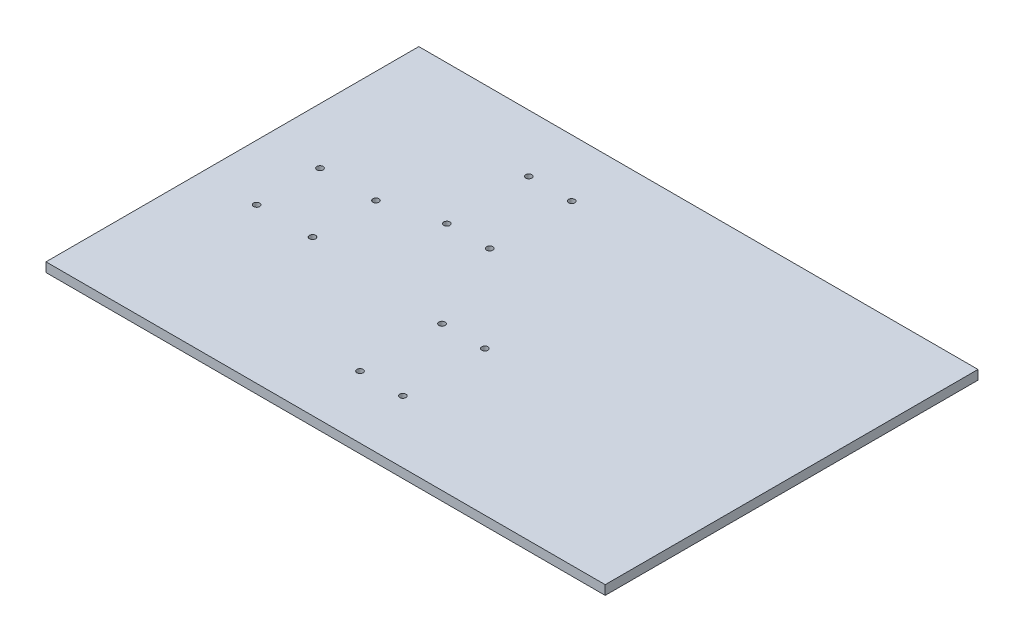
ISO-10303-21;
HEADER;
FILE_DESCRIPTION(('STEP AP214'),'2;1');
FILE_NAME('part.step','',(''),(''),'','','');
FILE_SCHEMA(('AUTOMOTIVE_DESIGN { 1 0 10303 214 1 1 1 1 }'));
ENDSEC;
DATA;
#1=APPLICATION_CONTEXT('core data for automotive mechanical design processes');
#2=APPLICATION_PROTOCOL_DEFINITION('international standard','automotive_design',2000,#1);
#3=PRODUCT_CONTEXT('',#1,'mechanical');
#4=PRODUCT('Part','Part','',(#3));
#5=PRODUCT_RELATED_PRODUCT_CATEGORY('part','',(#4));
#6=PRODUCT_DEFINITION_FORMATION('','',#4);
#7=PRODUCT_DEFINITION_CONTEXT('part definition',#1,'design');
#8=PRODUCT_DEFINITION('design','',#6,#7);
#9=PRODUCT_DEFINITION_SHAPE('','',#8);
#10=(LENGTH_UNIT() NAMED_UNIT(*) SI_UNIT(.MILLI.,.METRE.));
#11=(NAMED_UNIT(*) PLANE_ANGLE_UNIT() SI_UNIT($,.RADIAN.));
#12=(NAMED_UNIT(*) SI_UNIT($,.STERADIAN.) SOLID_ANGLE_UNIT());
#13=UNCERTAINTY_MEASURE_WITH_UNIT(LENGTH_MEASURE(1.E-05),#10,'distance_accuracy_value','');
#14=(GEOMETRIC_REPRESENTATION_CONTEXT(3) GLOBAL_UNCERTAINTY_ASSIGNED_CONTEXT((#13)) GLOBAL_UNIT_ASSIGNED_CONTEXT((#10,
#11,#12)) REPRESENTATION_CONTEXT('',''));
#15=CARTESIAN_POINT('',(0.,0.,0.));
#16=DIRECTION('',(0.,0.,1.));
#17=DIRECTION('',(1.,0.,0.));
#18=AXIS2_PLACEMENT_3D('',#15,#16,#17);
#19=CARTESIAN_POINT('',(0.,5.,0.));
#20=DIRECTION('',(0.,1.,0.));
#21=DIRECTION('',(0.,0.,1.));
#22=AXIS2_PLACEMENT_3D('',#19,#20,#21);
#23=PLANE('',#22);
#24=DIRECTION('',(-1.,0.,0.));
#25=VECTOR('',#24,1.);
#26=CARTESIAN_POINT('',(120.27471536396,5.,-74.770466694079));
#27=LINE('',#26,#25);
#28=CARTESIAN_POINT('',(343.507957149337,5.,-74.770466694079));
#29=VERTEX_POINT('',#28);
#30=CARTESIAN_POINT('',(43.5079571493369,5.,-74.770466694079));
#31=VERTEX_POINT('',#30);
#32=EDGE_CURVE('E12',#29,#31,#27,.T.);
#33=ORIENTED_EDGE('',*,*,#32,.T.);
#34=DIRECTION('',(0.,0.,-1.));
#35=VECTOR('',#34,1.);
#36=CARTESIAN_POINT('',(43.5079571493369,5.,-74.770466694079));
#37=LINE('',#36,#35);
#38=CARTESIAN_POINT('',(43.5079571493369,5.,125.229533305921));
#39=VERTEX_POINT('',#38);
#40=EDGE_CURVE('E224',#39,#31,#37,.T.);
#41=ORIENTED_EDGE('',*,*,#40,.F.);
#42=DIRECTION('',(1.,0.,0.));
#43=VECTOR('',#42,1.);
#44=CARTESIAN_POINT('',(43.5079571493369,5.,125.229533305921));
#45=LINE('',#44,#43);
#46=CARTESIAN_POINT('',(343.507957149337,5.,125.229533305921));
#47=VERTEX_POINT('',#46);
#48=EDGE_CURVE('E74',#39,#47,#45,.T.);
#49=ORIENTED_EDGE('',*,*,#48,.T.);
#50=DIRECTION('',(0.,0.,1.));
#51=VECTOR('',#50,1.);
#52=CARTESIAN_POINT('',(343.507957149337,5.,-74.770466694079));
#53=LINE('',#52,#51);
#54=EDGE_CURVE('E106',#29,#47,#53,.T.);
#55=ORIENTED_EDGE('',*,*,#54,.F.);
#56=EDGE_LOOP('',(#33,#41,#49,#55));
#57=FACE_BOUND('',#56,.T.);
#58=CARTESIAN_POINT('',(156.307957149337,5.,0.00953330592102431));
#59=DIRECTION('',(0.,-1.,0.));
#60=DIRECTION('',(0.,0.,-1.));
#61=AXIS2_PLACEMENT_3D('',#58,#59,#60);
#62=CIRCLE('',#61,1.64999999999998);
#63=CARTESIAN_POINT('',(156.307957149337,5.,-1.64046669407896));
#64=VERTEX_POINT('',#63);
#65=EDGE_CURVE('E144',#64,#64,#62,.F.);
#66=ORIENTED_EDGE('',*,*,#65,.F.);
#67=EDGE_LOOP('',(#66));
#68=FACE_BOUND('',#67,.T.);
#69=CARTESIAN_POINT('',(133.307957149337,5.,-43.990466694079));
#70=DIRECTION('',(0.,-1.,0.));
#71=DIRECTION('',(0.,0.,-1.));
#72=AXIS2_PLACEMENT_3D('',#69,#70,#71);
#73=CIRCLE('',#72,1.64999999999998);
#74=CARTESIAN_POINT('',(133.307957149337,5.,-45.640466694079));
#75=VERTEX_POINT('',#74);
#76=EDGE_CURVE('E136',#75,#75,#73,.F.);
#77=ORIENTED_EDGE('',*,*,#76,.F.);
#78=EDGE_LOOP('',(#77));
#79=FACE_BOUND('',#78,.T.);
#80=CARTESIAN_POINT('',(156.307957149337,5.,-43.990466694079));
#81=DIRECTION('',(0.,-1.,0.));
#82=DIRECTION('',(0.,0.,-1.));
#83=AXIS2_PLACEMENT_3D('',#80,#81,#82);
#84=CIRCLE('',#83,1.64999999999998);
#85=CARTESIAN_POINT('',(156.307957149337,5.,-45.640466694079));
#86=VERTEX_POINT('',#85);
#87=EDGE_CURVE('E140',#86,#86,#84,.F.);
#88=ORIENTED_EDGE('',*,*,#87,.F.);
#89=EDGE_LOOP('',(#88));
#90=FACE_BOUND('',#89,.T.);
#91=CARTESIAN_POINT('',(133.307957149337,5.,0.00953330592102431));
#92=DIRECTION('',(0.,-1.,0.));
#93=DIRECTION('',(0.,0.,-1.));
#94=AXIS2_PLACEMENT_3D('',#91,#92,#93);
#95=CIRCLE('',#94,1.64999999999998);
#96=CARTESIAN_POINT('',(133.307957149337,5.,-1.64046669407896));
#97=VERTEX_POINT('',#96);
#98=EDGE_CURVE('E148',#97,#97,#95,.F.);
#99=ORIENTED_EDGE('',*,*,#98,.F.);
#100=EDGE_LOOP('',(#99));
#101=FACE_BOUND('',#100,.T.);
#102=CARTESIAN_POINT('',(201.507957149337,5.,91.7795333059211));
#103=DIRECTION('',(0.,-1.,0.));
#104=DIRECTION('',(0.,0.,-1.));
#105=AXIS2_PLACEMENT_3D('',#102,#103,#104);
#106=CIRCLE('',#105,1.64999999999998);
#107=CARTESIAN_POINT('',(201.507957149337,5.,90.1295333059211));
#108=VERTEX_POINT('',#107);
#109=EDGE_CURVE('E160',#108,#108,#106,.F.);
#110=ORIENTED_EDGE('',*,*,#109,.F.);
#111=EDGE_LOOP('',(#110));
#112=FACE_BOUND('',#111,.T.);
#113=CARTESIAN_POINT('',(178.507957149337,5.,47.779533305921));
#114=DIRECTION('',(0.,-1.,0.));
#115=DIRECTION('',(0.,0.,-1.));
#116=AXIS2_PLACEMENT_3D('',#113,#114,#115);
#117=CIRCLE('',#116,1.64999999999998);
#118=CARTESIAN_POINT('',(178.507957149337,5.,46.1295333059211));
#119=VERTEX_POINT('',#118);
#120=EDGE_CURVE('E152',#119,#119,#117,.F.);
#121=ORIENTED_EDGE('',*,*,#120,.F.);
#122=EDGE_LOOP('',(#121));
#123=FACE_BOUND('',#122,.T.);
#124=CARTESIAN_POINT('',(201.507957149337,5.,47.779533305921));
#125=DIRECTION('',(0.,-1.,0.));
#126=DIRECTION('',(0.,0.,-1.));
#127=AXIS2_PLACEMENT_3D('',#124,#125,#126);
#128=CIRCLE('',#127,1.64999999999998);
#129=CARTESIAN_POINT('',(201.507957149337,5.,46.1295333059211));
#130=VERTEX_POINT('',#129);
#131=EDGE_CURVE('E156',#130,#130,#128,.F.);
#132=ORIENTED_EDGE('',*,*,#131,.F.);
#133=EDGE_LOOP('',(#132));
#134=FACE_BOUND('',#133,.T.);
#135=CARTESIAN_POINT('',(178.507957149337,5.,91.7795333059211));
#136=DIRECTION('',(0.,-1.,0.));
#137=DIRECTION('',(0.,0.,-1.));
#138=AXIS2_PLACEMENT_3D('',#135,#136,#137);
#139=CIRCLE('',#138,1.64999999999998);
#140=CARTESIAN_POINT('',(178.507957149337,5.,90.1295333059211));
#141=VERTEX_POINT('',#140);
#142=EDGE_CURVE('E164',#141,#141,#139,.F.);
#143=ORIENTED_EDGE('',*,*,#142,.F.);
#144=EDGE_LOOP('',(#143));
#145=FACE_BOUND('',#144,.T.);
#146=CARTESIAN_POINT('',(103.507957149337,5.,42.2295333059211));
#147=DIRECTION('',(0.,-1.,0.));
#148=DIRECTION('',(0.,0.,-1.));
#149=AXIS2_PLACEMENT_3D('',#146,#147,#148);
#150=CIRCLE('',#149,1.64999999999999);
#151=CARTESIAN_POINT('',(103.507957149337,5.,40.5795333059211));
#152=VERTEX_POINT('',#151);
#153=EDGE_CURVE('E128',#152,#152,#150,.F.);
#154=ORIENTED_EDGE('',*,*,#153,.F.);
#155=EDGE_LOOP('',(#154));
#156=FACE_BOUND('',#155,.T.);
#157=CARTESIAN_POINT('',(73.5079571493369,5.,8.22953330592103));
#158=DIRECTION('',(0.,-1.,0.));
#159=DIRECTION('',(0.,0.,-1.));
#160=AXIS2_PLACEMENT_3D('',#157,#158,#159);
#161=CIRCLE('',#160,1.64999999999999);
#162=CARTESIAN_POINT('',(73.5079571493369,5.,6.57953330592104));
#163=VERTEX_POINT('',#162);
#164=EDGE_CURVE('E60',#163,#163,#161,.F.);
#165=ORIENTED_EDGE('',*,*,#164,.F.);
#166=EDGE_LOOP('',(#165));
#167=FACE_BOUND('',#166,.T.);
#168=CARTESIAN_POINT('',(103.507957149337,5.,8.22953330592102));
#169=DIRECTION('',(0.,-1.,0.));
#170=DIRECTION('',(0.,0.,-1.));
#171=AXIS2_PLACEMENT_3D('',#168,#169,#170);
#172=CIRCLE('',#171,1.64999999999999);
#173=CARTESIAN_POINT('',(103.507957149337,5.,6.57953330592103));
#174=VERTEX_POINT('',#173);
#175=EDGE_CURVE('E124',#174,#174,#172,.F.);
#176=ORIENTED_EDGE('',*,*,#175,.F.);
#177=EDGE_LOOP('',(#176));
#178=FACE_BOUND('',#177,.T.);
#179=CARTESIAN_POINT('',(73.5079571493369,5.,42.229533305921));
#180=DIRECTION('',(0.,-1.,0.));
#181=DIRECTION('',(0.,0.,-1.));
#182=AXIS2_PLACEMENT_3D('',#179,#180,#181);
#183=CIRCLE('',#182,1.64999999999999);
#184=CARTESIAN_POINT('',(73.5079571493369,5.,40.5795333059211));
#185=VERTEX_POINT('',#184);
#186=EDGE_CURVE('E132',#185,#185,#183,.F.);
#187=ORIENTED_EDGE('',*,*,#186,.F.);
#188=EDGE_LOOP('',(#187));
#189=FACE_BOUND('',#188,.T.);
#190=ADVANCED_FACE('F56',(#57,#68,#79,#90,#101,#112,#123,#134,#145,#156,#167,#178,#189),#23,.T.);
#191=CARTESIAN_POINT('',(0.,0.,0.));
#192=DIRECTION('',(0.,1.,0.));
#193=DIRECTION('',(0.,0.,1.));
#194=AXIS2_PLACEMENT_3D('',#191,#192,#193);
#195=PLANE('',#194);
#196=CARTESIAN_POINT('',(73.5079571493369,-1.85615411929518E-13,8.22953330592103));
#197=DIRECTION('',(0.,1.,0.));
#198=DIRECTION('',(0.,0.,1.));
#199=AXIS2_PLACEMENT_3D('',#196,#197,#198);
#200=CIRCLE('',#199,1.65);
#201=CARTESIAN_POINT('',(73.5079571493369,-1.85615411929518E-13,9.87953330592103));
#202=VERTEX_POINT('',#201);
#203=EDGE_CURVE('E168',#202,#202,#200,.T.);
#204=ORIENTED_EDGE('',*,*,#203,.T.);
#205=EDGE_LOOP('',(#204));
#206=FACE_BOUND('',#205,.T.);
#207=CARTESIAN_POINT('',(103.507957149337,-1.85615411929518E-13,8.22953330592102));
#208=DIRECTION('',(0.,1.,0.));
#209=DIRECTION('',(0.,0.,1.));
#210=AXIS2_PLACEMENT_3D('',#207,#208,#209);
#211=CIRCLE('',#210,1.65);
#212=CARTESIAN_POINT('',(103.507957149337,-1.85615411929518E-13,9.87953330592102));
#213=VERTEX_POINT('',#212);
#214=EDGE_CURVE('E172',#213,#213,#211,.T.);
#215=ORIENTED_EDGE('',*,*,#214,.T.);
#216=EDGE_LOOP('',(#215));
#217=FACE_BOUND('',#216,.T.);
#218=CARTESIAN_POINT('',(103.507957149337,-1.85615411929518E-13,42.2295333059211));
#219=DIRECTION('',(0.,1.,0.));
#220=DIRECTION('',(0.,0.,1.));
#221=AXIS2_PLACEMENT_3D('',#218,#219,#220);
#222=CIRCLE('',#221,1.65);
#223=CARTESIAN_POINT('',(103.507957149337,-1.85615411929518E-13,43.8795333059211));
#224=VERTEX_POINT('',#223);
#225=EDGE_CURVE('E176',#224,#224,#222,.T.);
#226=ORIENTED_EDGE('',*,*,#225,.T.);
#227=EDGE_LOOP('',(#226));
#228=FACE_BOUND('',#227,.T.);
#229=CARTESIAN_POINT('',(73.5079571493369,-1.85615411929518E-13,42.229533305921));
#230=DIRECTION('',(0.,1.,0.));
#231=DIRECTION('',(0.,0.,1.));
#232=AXIS2_PLACEMENT_3D('',#229,#230,#231);
#233=CIRCLE('',#232,1.65);
#234=CARTESIAN_POINT('',(73.5079571493369,-1.85615411929518E-13,43.879533305921));
#235=VERTEX_POINT('',#234);
#236=EDGE_CURVE('E180',#235,#235,#233,.T.);
#237=ORIENTED_EDGE('',*,*,#236,.T.);
#238=EDGE_LOOP('',(#237));
#239=FACE_BOUND('',#238,.T.);
#240=CARTESIAN_POINT('',(133.307957149337,-1.80411241501588E-13,-43.990466694079));
#241=DIRECTION('',(0.,1.,0.));
#242=DIRECTION('',(0.,0.,1.));
#243=AXIS2_PLACEMENT_3D('',#240,#241,#242);
#244=CIRCLE('',#243,1.64999999999998);
#245=CARTESIAN_POINT('',(133.307957149337,-1.80615691054114E-13,-42.340466694079));
#246=VERTEX_POINT('',#245);
#247=EDGE_CURVE('E184',#246,#246,#244,.T.);
#248=ORIENTED_EDGE('',*,*,#247,.T.);
#249=EDGE_LOOP('',(#248));
#250=FACE_BOUND('',#249,.T.);
#251=CARTESIAN_POINT('',(156.307957149337,-1.80411241501588E-13,-43.990466694079));
#252=DIRECTION('',(0.,1.,0.));
#253=DIRECTION('',(0.,0.,1.));
#254=AXIS2_PLACEMENT_3D('',#251,#252,#253);
#255=CIRCLE('',#254,1.64999999999998);
#256=CARTESIAN_POINT('',(156.307957149337,-1.80615691054114E-13,-42.340466694079));
#257=VERTEX_POINT('',#256);
#258=EDGE_CURVE('E188',#257,#257,#255,.T.);
#259=ORIENTED_EDGE('',*,*,#258,.T.);
#260=EDGE_LOOP('',(#259));
#261=FACE_BOUND('',#260,.T.);
#262=CARTESIAN_POINT('',(156.307957149337,-1.85615411929518E-13,0.00953330592102369));
#263=DIRECTION('',(0.,1.,0.));
#264=DIRECTION('',(0.,0.,1.));
#265=AXIS2_PLACEMENT_3D('',#262,#263,#264);
#266=CIRCLE('',#265,1.64999999999998);
#267=CARTESIAN_POINT('',(156.307957149337,-1.85819861482044E-13,1.65953330592101));
#268=VERTEX_POINT('',#267);
#269=EDGE_CURVE('E192',#268,#268,#266,.T.);
#270=ORIENTED_EDGE('',*,*,#269,.T.);
#271=EDGE_LOOP('',(#270));
#272=FACE_BOUND('',#271,.T.);
#273=CARTESIAN_POINT('',(133.307957149337,-1.85615411929518E-13,0.00953330592102369));
#274=DIRECTION('',(0.,1.,0.));
#275=DIRECTION('',(0.,0.,1.));
#276=AXIS2_PLACEMENT_3D('',#273,#274,#275);
#277=CIRCLE('',#276,1.64999999999998);
#278=CARTESIAN_POINT('',(133.307957149337,-1.85819861482044E-13,1.65953330592101));
#279=VERTEX_POINT('',#278);
#280=EDGE_CURVE('E196',#279,#279,#277,.T.);
#281=ORIENTED_EDGE('',*,*,#280,.T.);
#282=EDGE_LOOP('',(#281));
#283=FACE_BOUND('',#282,.T.);
#284=CARTESIAN_POINT('',(178.507957149337,-1.78676518025611E-13,47.779533305921));
#285=DIRECTION('',(0.,1.,0.));
#286=DIRECTION('',(0.,0.,1.));
#287=AXIS2_PLACEMENT_3D('',#284,#285,#286);
#288=CIRCLE('',#287,1.64999999999998);
#289=CARTESIAN_POINT('',(178.507957149337,-1.7724537115793E-13,49.429533305921));
#290=VERTEX_POINT('',#289);
#291=EDGE_CURVE('E200',#290,#290,#288,.T.);
#292=ORIENTED_EDGE('',*,*,#291,.T.);
#293=EDGE_LOOP('',(#292));
#294=FACE_BOUND('',#293,.T.);
#295=CARTESIAN_POINT('',(201.507957149337,-1.78676518025611E-13,47.779533305921));
#296=DIRECTION('',(0.,1.,0.));
#297=DIRECTION('',(0.,0.,1.));
#298=AXIS2_PLACEMENT_3D('',#295,#296,#297);
#299=CIRCLE('',#298,1.64999999999998);
#300=CARTESIAN_POINT('',(201.507957149337,-1.7724537115793E-13,49.429533305921));
#301=VERTEX_POINT('',#300);
#302=EDGE_CURVE('E204',#301,#301,#299,.T.);
#303=ORIENTED_EDGE('',*,*,#302,.T.);
#304=EDGE_LOOP('',(#303));
#305=FACE_BOUND('',#304,.T.);
#306=CARTESIAN_POINT('',(201.507957149337,-1.40512601554121E-13,91.7795333059211));
#307=DIRECTION('',(0.,1.,0.));
#308=DIRECTION('',(0.,0.,1.));
#309=AXIS2_PLACEMENT_3D('',#306,#307,#308);
#310=CIRCLE('',#309,1.64999999999998);
#311=CARTESIAN_POINT('',(201.507957149337,-1.39081454686441E-13,93.429533305921));
#312=VERTEX_POINT('',#311);
#313=EDGE_CURVE('E208',#312,#312,#310,.T.);
#314=ORIENTED_EDGE('',*,*,#313,.T.);
#315=EDGE_LOOP('',(#314));
#316=FACE_BOUND('',#315,.T.);
#317=CARTESIAN_POINT('',(178.507957149337,-1.40512601554121E-13,91.7795333059211));
#318=DIRECTION('',(0.,1.,0.));
#319=DIRECTION('',(0.,0.,1.));
#320=AXIS2_PLACEMENT_3D('',#317,#318,#319);
#321=CIRCLE('',#320,1.64999999999998);
#322=CARTESIAN_POINT('',(178.507957149337,-1.39081454686441E-13,93.429533305921));
#323=VERTEX_POINT('',#322);
#324=EDGE_CURVE('E212',#323,#323,#321,.T.);
#325=ORIENTED_EDGE('',*,*,#324,.T.);
#326=EDGE_LOOP('',(#325));
#327=FACE_BOUND('',#326,.T.);
#328=DIRECTION('',(-1.,0.,0.));
#329=VECTOR('',#328,1.);
#330=CARTESIAN_POINT('',(120.27471536396,0.,-74.770466694079));
#331=LINE('',#330,#329);
#332=CARTESIAN_POINT('',(343.507957149337,0.,-74.770466694079));
#333=VERTEX_POINT('',#332);
#334=CARTESIAN_POINT('',(43.5079571493369,0.,-74.770466694079));
#335=VERTEX_POINT('',#334);
#336=EDGE_CURVE('E66',#333,#335,#331,.T.);
#337=ORIENTED_EDGE('',*,*,#336,.F.);
#338=DIRECTION('',(0.,0.,-1.));
#339=VECTOR('',#338,1.);
#340=CARTESIAN_POINT('',(343.507957149337,0.,125.229533305921));
#341=LINE('',#340,#339);
#342=CARTESIAN_POINT('',(343.507957149337,0.,125.229533305921));
#343=VERTEX_POINT('',#342);
#344=EDGE_CURVE('E116',#343,#333,#341,.T.);
#345=ORIENTED_EDGE('',*,*,#344,.F.);
#346=DIRECTION('',(-1.,0.,0.));
#347=VECTOR('',#346,1.);
#348=CARTESIAN_POINT('',(43.5079571493369,0.,125.229533305921));
#349=LINE('',#348,#347);
#350=CARTESIAN_POINT('',(43.5079571493369,-1.11022302462516E-13,125.229533305921));
#351=VERTEX_POINT('',#350);
#352=EDGE_CURVE('E221',#343,#351,#349,.T.);
#353=ORIENTED_EDGE('',*,*,#352,.T.);
#354=DIRECTION('',(0.,0.,-1.));
#355=VECTOR('',#354,1.);
#356=CARTESIAN_POINT('',(43.5079571493369,0.,0.));
#357=LINE('',#356,#355);
#358=EDGE_CURVE('E229',#351,#335,#357,.T.);
#359=ORIENTED_EDGE('',*,*,#358,.T.);
#360=EDGE_LOOP('',(#337,#345,#353,#359));
#361=FACE_BOUND('',#360,.T.);
#362=ADVANCED_FACE('F241',(#206,#217,#228,#239,#250,#261,#272,#283,#294,#305,#316,#327,#361),
#195,.F.);
#363=CARTESIAN_POINT('',(120.27471536396,5.,-74.770466694079));
#364=DIRECTION('',(0.,0.,1.));
#365=DIRECTION('',(1.,0.,0.));
#366=AXIS2_PLACEMENT_3D('',#363,#364,#365);
#367=PLANE('',#366);
#368=ORIENTED_EDGE('',*,*,#32,.F.);
#369=DIRECTION('',(0.,1.,0.));
#370=VECTOR('',#369,1.);
#371=CARTESIAN_POINT('',(343.507957149337,0.,-74.770466694079));
#372=LINE('',#371,#370);
#373=EDGE_CURVE('E99',#333,#29,#372,.T.);
#374=ORIENTED_EDGE('',*,*,#373,.F.);
#375=ORIENTED_EDGE('',*,*,#336,.T.);
#376=DIRECTION('',(0.,1.,0.));
#377=VECTOR('',#376,1.);
#378=CARTESIAN_POINT('',(43.5079571493369,-5.,-74.770466694079));
#379=LINE('',#378,#377);
#380=EDGE_CURVE('E101',#335,#31,#379,.T.);
#381=ORIENTED_EDGE('',*,*,#380,.T.);
#382=EDGE_LOOP('',(#368,#374,#375,#381));
#383=FACE_BOUND('',#382,.T.);
#384=ADVANCED_FACE('F58',(#383),#367,.F.);
#385=CARTESIAN_POINT('',(43.5079571493369,-282.842712474619,125.229533305921));
#386=DIRECTION('',(0.,0.,1.));
#387=DIRECTION('',(1.,0.,0.));
#388=AXIS2_PLACEMENT_3D('',#385,#386,#387);
#389=PLANE('',#388);
#390=ORIENTED_EDGE('',*,*,#352,.F.);
#391=DIRECTION('',(0.,-1.,0.));
#392=VECTOR('',#391,1.);
#393=CARTESIAN_POINT('',(343.507957149337,5.,125.229533305921));
#394=LINE('',#393,#392);
#395=EDGE_CURVE('E111',#47,#343,#394,.T.);
#396=ORIENTED_EDGE('',*,*,#395,.F.);
#397=ORIENTED_EDGE('',*,*,#48,.F.);
#398=DIRECTION('',(0.,1.,0.));
#399=VECTOR('',#398,1.);
#400=CARTESIAN_POINT('',(43.5079571493369,-1.11022302462516E-13,125.229533305921));
#401=LINE('',#400,#399);
#402=EDGE_CURVE('E216',#351,#39,#401,.T.);
#403=ORIENTED_EDGE('',*,*,#402,.F.);
#404=EDGE_LOOP('',(#390,#396,#397,#403));
#405=FACE_BOUND('',#404,.T.);
#406=ADVANCED_FACE('F277',(#405),#389,.T.);
#407=CARTESIAN_POINT('',(43.5079571493369,-5.,-74.770466694079));
#408=DIRECTION('',(1.,0.,0.));
#409=DIRECTION('',(0.,0.,-1.));
#410=AXIS2_PLACEMENT_3D('',#407,#408,#409);
#411=PLANE('',#410);
#412=ORIENTED_EDGE('',*,*,#402,.T.);
#413=ORIENTED_EDGE('',*,*,#40,.T.);
#414=ORIENTED_EDGE('',*,*,#380,.F.);
#415=ORIENTED_EDGE('',*,*,#358,.F.);
#416=EDGE_LOOP('',(#412,#413,#414,#415));
#417=FACE_BOUND('',#416,.T.);
#418=ADVANCED_FACE('F276',(#417),#411,.F.);
#419=CARTESIAN_POINT('',(178.507957149337,14.,91.779533305921));
#420=DIRECTION('',(0.,1.,0.));
#421=DIRECTION('',(0.,0.,1.));
#422=AXIS2_PLACEMENT_3D('',#419,#420,#421);
#423=CYLINDRICAL_SURFACE('',#422,1.64999999999998);
#424=ORIENTED_EDGE('',*,*,#142,.T.);
#425=EDGE_LOOP('',(#424));
#426=FACE_BOUND('',#425,.T.);
#427=ORIENTED_EDGE('',*,*,#324,.F.);
#428=EDGE_LOOP('',(#427));
#429=FACE_BOUND('',#428,.T.);
#430=ADVANCED_FACE('F285',(#426,#429),#423,.F.);
#431=CARTESIAN_POINT('',(201.507957149337,14.,91.779533305921));
#432=DIRECTION('',(0.,1.,0.));
#433=DIRECTION('',(0.,0.,1.));
#434=AXIS2_PLACEMENT_3D('',#431,#432,#433);
#435=CYLINDRICAL_SURFACE('',#434,1.64999999999998);
#436=ORIENTED_EDGE('',*,*,#109,.T.);
#437=EDGE_LOOP('',(#436));
#438=FACE_BOUND('',#437,.T.);
#439=ORIENTED_EDGE('',*,*,#313,.F.);
#440=EDGE_LOOP('',(#439));
#441=FACE_BOUND('',#440,.T.);
#442=ADVANCED_FACE('F290',(#438,#441),#435,.F.);
#443=CARTESIAN_POINT('',(201.507957149337,14.,47.779533305921));
#444=DIRECTION('',(0.,1.,0.));
#445=DIRECTION('',(0.,0.,1.));
#446=AXIS2_PLACEMENT_3D('',#443,#444,#445);
#447=CYLINDRICAL_SURFACE('',#446,1.64999999999998);
#448=ORIENTED_EDGE('',*,*,#131,.T.);
#449=EDGE_LOOP('',(#448));
#450=FACE_BOUND('',#449,.T.);
#451=ORIENTED_EDGE('',*,*,#302,.F.);
#452=EDGE_LOOP('',(#451));
#453=FACE_BOUND('',#452,.T.);
#454=ADVANCED_FACE('F294',(#450,#453),#447,.F.);
#455=CARTESIAN_POINT('',(178.507957149337,14.,47.779533305921));
#456=DIRECTION('',(0.,1.,0.));
#457=DIRECTION('',(0.,0.,1.));
#458=AXIS2_PLACEMENT_3D('',#455,#456,#457);
#459=CYLINDRICAL_SURFACE('',#458,1.64999999999998);
#460=ORIENTED_EDGE('',*,*,#120,.T.);
#461=EDGE_LOOP('',(#460));
#462=FACE_BOUND('',#461,.T.);
#463=ORIENTED_EDGE('',*,*,#291,.F.);
#464=EDGE_LOOP('',(#463));
#465=FACE_BOUND('',#464,.T.);
#466=ADVANCED_FACE('F298',(#462,#465),#459,.F.);
#467=CARTESIAN_POINT('',(133.307957149337,14.,0.00953330592102543));
#468=DIRECTION('',(0.,1.,0.));
#469=DIRECTION('',(0.,0.,1.));
#470=AXIS2_PLACEMENT_3D('',#467,#468,#469);
#471=CYLINDRICAL_SURFACE('',#470,1.64999999999998);
#472=ORIENTED_EDGE('',*,*,#98,.T.);
#473=EDGE_LOOP('',(#472));
#474=FACE_BOUND('',#473,.T.);
#475=ORIENTED_EDGE('',*,*,#280,.F.);
#476=EDGE_LOOP('',(#475));
#477=FACE_BOUND('',#476,.T.);
#478=ADVANCED_FACE('F302',(#474,#477),#471,.F.);
#479=CARTESIAN_POINT('',(156.307957149337,14.,0.00953330592102543));
#480=DIRECTION('',(0.,1.,0.));
#481=DIRECTION('',(0.,0.,1.));
#482=AXIS2_PLACEMENT_3D('',#479,#480,#481);
#483=CYLINDRICAL_SURFACE('',#482,1.64999999999998);
#484=ORIENTED_EDGE('',*,*,#65,.T.);
#485=EDGE_LOOP('',(#484));
#486=FACE_BOUND('',#485,.T.);
#487=ORIENTED_EDGE('',*,*,#269,.F.);
#488=EDGE_LOOP('',(#487));
#489=FACE_BOUND('',#488,.T.);
#490=ADVANCED_FACE('F306',(#486,#489),#483,.F.);
#491=CARTESIAN_POINT('',(156.307957149337,14.,-43.990466694079));
#492=DIRECTION('',(0.,1.,0.));
#493=DIRECTION('',(0.,0.,1.));
#494=AXIS2_PLACEMENT_3D('',#491,#492,#493);
#495=CYLINDRICAL_SURFACE('',#494,1.64999999999998);
#496=ORIENTED_EDGE('',*,*,#87,.T.);
#497=EDGE_LOOP('',(#496));
#498=FACE_BOUND('',#497,.T.);
#499=ORIENTED_EDGE('',*,*,#258,.F.);
#500=EDGE_LOOP('',(#499));
#501=FACE_BOUND('',#500,.T.);
#502=ADVANCED_FACE('F310',(#498,#501),#495,.F.);
#503=CARTESIAN_POINT('',(133.307957149337,14.,-43.990466694079));
#504=DIRECTION('',(0.,1.,0.));
#505=DIRECTION('',(0.,0.,1.));
#506=AXIS2_PLACEMENT_3D('',#503,#504,#505);
#507=CYLINDRICAL_SURFACE('',#506,1.64999999999998);
#508=ORIENTED_EDGE('',*,*,#76,.T.);
#509=EDGE_LOOP('',(#508));
#510=FACE_BOUND('',#509,.T.);
#511=ORIENTED_EDGE('',*,*,#247,.F.);
#512=EDGE_LOOP('',(#511));
#513=FACE_BOUND('',#512,.T.);
#514=ADVANCED_FACE('F251',(#510,#513),#507,.F.);
#515=CARTESIAN_POINT('',(73.5079571493369,14.,42.229533305921));
#516=DIRECTION('',(0.,1.,0.));
#517=DIRECTION('',(0.,0.,1.));
#518=AXIS2_PLACEMENT_3D('',#515,#516,#517);
#519=CYLINDRICAL_SURFACE('',#518,1.64999999999999);
#520=ORIENTED_EDGE('',*,*,#186,.T.);
#521=EDGE_LOOP('',(#520));
#522=FACE_BOUND('',#521,.T.);
#523=ORIENTED_EDGE('',*,*,#236,.F.);
#524=EDGE_LOOP('',(#523));
#525=FACE_BOUND('',#524,.T.);
#526=ADVANCED_FACE('F247',(#522,#525),#519,.F.);
#527=CARTESIAN_POINT('',(103.507957149337,14.,42.2295333059211));
#528=DIRECTION('',(0.,1.,0.));
#529=DIRECTION('',(0.,0.,1.));
#530=AXIS2_PLACEMENT_3D('',#527,#528,#529);
#531=CYLINDRICAL_SURFACE('',#530,1.64999999999999);
#532=ORIENTED_EDGE('',*,*,#153,.T.);
#533=EDGE_LOOP('',(#532));
#534=FACE_BOUND('',#533,.T.);
#535=ORIENTED_EDGE('',*,*,#225,.F.);
#536=EDGE_LOOP('',(#535));
#537=FACE_BOUND('',#536,.T.);
#538=ADVANCED_FACE('F250',(#534,#537),#531,.F.);
#539=CARTESIAN_POINT('',(103.507957149337,14.,8.22953330592102));
#540=DIRECTION('',(0.,1.,0.));
#541=DIRECTION('',(0.,0.,1.));
#542=AXIS2_PLACEMENT_3D('',#539,#540,#541);
#543=CYLINDRICAL_SURFACE('',#542,1.64999999999999);
#544=ORIENTED_EDGE('',*,*,#175,.T.);
#545=EDGE_LOOP('',(#544));
#546=FACE_BOUND('',#545,.T.);
#547=ORIENTED_EDGE('',*,*,#214,.F.);
#548=EDGE_LOOP('',(#547));
#549=FACE_BOUND('',#548,.T.);
#550=ADVANCED_FACE('F320',(#546,#549),#543,.F.);
#551=CARTESIAN_POINT('',(73.5079571493369,14.,8.22953330592103));
#552=DIRECTION('',(0.,1.,0.));
#553=DIRECTION('',(0.,0.,1.));
#554=AXIS2_PLACEMENT_3D('',#551,#552,#553);
#555=CYLINDRICAL_SURFACE('',#554,1.64999999999999);
#556=ORIENTED_EDGE('',*,*,#164,.T.);
#557=EDGE_LOOP('',(#556));
#558=FACE_BOUND('',#557,.T.);
#559=ORIENTED_EDGE('',*,*,#203,.F.);
#560=EDGE_LOOP('',(#559));
#561=FACE_BOUND('',#560,.T.);
#562=ADVANCED_FACE('F236',(#558,#561),#555,.F.);
#563=CARTESIAN_POINT('',(343.507957149337,0.,0.));
#564=DIRECTION('',(1.,0.,0.));
#565=DIRECTION('',(0.,0.,-1.));
#566=AXIS2_PLACEMENT_3D('',#563,#564,#565);
#567=PLANE('',#566);
#568=ORIENTED_EDGE('',*,*,#373,.T.);
#569=ORIENTED_EDGE('',*,*,#54,.T.);
#570=ORIENTED_EDGE('',*,*,#395,.T.);
#571=ORIENTED_EDGE('',*,*,#344,.T.);
#572=EDGE_LOOP('',(#568,#569,#570,#571));
#573=FACE_BOUND('',#572,.T.);
#574=ADVANCED_FACE('F114',(#573),#567,.T.);
#575=CLOSED_SHELL('',(#190,#362,#384,#406,#418,#430,#442,#454,#466,#478,#490,#502,#514,#526,
#538,#550,#562,#574));
#576=MANIFOLD_SOLID_BREP('B2',#575);
#577=ADVANCED_BREP_SHAPE_REPRESENTATION('',(#18,#576),#14);
#578=SHAPE_DEFINITION_REPRESENTATION(#9,#577);
ENDSEC;
END-ISO-10303-21;
